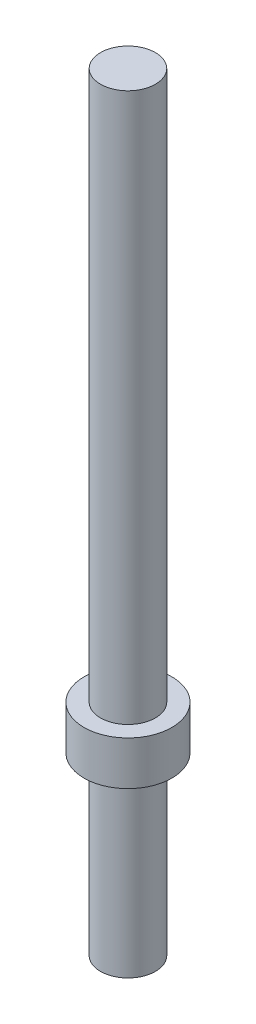
ISO-10303-21;
HEADER;
FILE_DESCRIPTION(('STEP AP214'),'2;1');
FILE_NAME('part.step','',(''),(''),'','','');
FILE_SCHEMA(('AUTOMOTIVE_DESIGN { 1 0 10303 214 1 1 1 1 }'));
ENDSEC;
DATA;
#1=APPLICATION_CONTEXT('core data for automotive mechanical design processes');
#2=APPLICATION_PROTOCOL_DEFINITION('international standard','automotive_design',2000,#1);
#3=PRODUCT_CONTEXT('',#1,'mechanical');
#4=PRODUCT('Part','Part','',(#3));
#5=PRODUCT_RELATED_PRODUCT_CATEGORY('part','',(#4));
#6=PRODUCT_DEFINITION_FORMATION('','',#4);
#7=PRODUCT_DEFINITION_CONTEXT('part definition',#1,'design');
#8=PRODUCT_DEFINITION('design','',#6,#7);
#9=PRODUCT_DEFINITION_SHAPE('','',#8);
#10=(LENGTH_UNIT() NAMED_UNIT(*) SI_UNIT(.MILLI.,.METRE.));
#11=(NAMED_UNIT(*) PLANE_ANGLE_UNIT() SI_UNIT($,.RADIAN.));
#12=(NAMED_UNIT(*) SI_UNIT($,.STERADIAN.) SOLID_ANGLE_UNIT());
#13=UNCERTAINTY_MEASURE_WITH_UNIT(LENGTH_MEASURE(1.E-05),#10,'distance_accuracy_value','');
#14=(GEOMETRIC_REPRESENTATION_CONTEXT(3) GLOBAL_UNCERTAINTY_ASSIGNED_CONTEXT((#13)) GLOBAL_UNIT_ASSIGNED_CONTEXT((#10,
#11,#12)) REPRESENTATION_CONTEXT('',''));
#15=CARTESIAN_POINT('',(0.,0.,0.));
#16=DIRECTION('',(0.,0.,1.));
#17=DIRECTION('',(1.,0.,0.));
#18=AXIS2_PLACEMENT_3D('',#15,#16,#17);
#19=CARTESIAN_POINT('',(0.,50.,0.));
#20=DIRECTION('',(0.,-1.,0.));
#21=DIRECTION('',(0.,0.,-1.));
#22=AXIS2_PLACEMENT_3D('',#19,#20,#21);
#23=CYLINDRICAL_SURFACE('',#22,2.5);
#24=CARTESIAN_POINT('',(0.,50.,0.));
#25=DIRECTION('',(0.,1.,0.));
#26=DIRECTION('',(0.,0.,1.));
#27=AXIS2_PLACEMENT_3D('',#24,#25,#26);
#28=CIRCLE('',#27,2.5);
#29=CARTESIAN_POINT('',(0.,50.,2.5));
#30=VERTEX_POINT('',#29);
#31=EDGE_CURVE('E10',#30,#30,#28,.T.);
#32=ORIENTED_EDGE('',*,*,#31,.F.);
#33=EDGE_LOOP('',(#32));
#34=FACE_BOUND('',#33,.T.);
#35=CARTESIAN_POINT('',(0.,0.,0.));
#36=DIRECTION('',(0.,1.,0.));
#37=DIRECTION('',(0.,0.,1.));
#38=AXIS2_PLACEMENT_3D('',#35,#36,#37);
#39=CIRCLE('',#38,2.5);
#40=CARTESIAN_POINT('',(0.,0.,2.5));
#41=VERTEX_POINT('',#40);
#42=EDGE_CURVE('E36',#41,#41,#39,.T.);
#43=ORIENTED_EDGE('',*,*,#42,.T.);
#44=EDGE_LOOP('',(#43));
#45=FACE_BOUND('',#44,.T.);
#46=ADVANCED_FACE('F30',(#34,#45),#23,.T.);
#47=CARTESIAN_POINT('',(0.,50.,0.));
#48=DIRECTION('',(0.,1.,0.));
#49=DIRECTION('',(0.,0.,1.));
#50=AXIS2_PLACEMENT_3D('',#47,#48,#49);
#51=PLANE('',#50);
#52=ORIENTED_EDGE('',*,*,#31,.T.);
#53=EDGE_LOOP('',(#52));
#54=FACE_BOUND('',#53,.T.);
#55=ADVANCED_FACE('F68',(#54),#51,.T.);
#56=CARTESIAN_POINT('',(0.,-4.,0.));
#57=DIRECTION('',(0.,1.,0.));
#58=DIRECTION('',(0.,0.,1.));
#59=AXIS2_PLACEMENT_3D('',#56,#57,#58);
#60=CYLINDRICAL_SURFACE('',#59,4.);
#61=CARTESIAN_POINT('',(0.,-4.,0.));
#62=DIRECTION('',(0.,1.,0.));
#63=DIRECTION('',(0.,0.,1.));
#64=AXIS2_PLACEMENT_3D('',#61,#62,#63);
#65=CIRCLE('',#64,4.);
#66=CARTESIAN_POINT('',(0.,-4.,4.));
#67=VERTEX_POINT('',#66);
#68=EDGE_CURVE('E40',#67,#67,#65,.T.);
#69=ORIENTED_EDGE('',*,*,#68,.T.);
#70=EDGE_LOOP('',(#69));
#71=FACE_BOUND('',#70,.T.);
#72=CARTESIAN_POINT('',(0.,0.,0.));
#73=DIRECTION('',(0.,1.,0.));
#74=DIRECTION('',(0.,0.,1.));
#75=AXIS2_PLACEMENT_3D('',#72,#73,#74);
#76=CIRCLE('',#75,4.);
#77=CARTESIAN_POINT('',(0.,0.,4.));
#78=VERTEX_POINT('',#77);
#79=EDGE_CURVE('E44',#78,#78,#76,.T.);
#80=ORIENTED_EDGE('',*,*,#79,.F.);
#81=EDGE_LOOP('',(#80));
#82=FACE_BOUND('',#81,.T.);
#83=ADVANCED_FACE('F73',(#71,#82),#60,.T.);
#84=CARTESIAN_POINT('',(0.,-4.,0.));
#85=DIRECTION('',(0.,1.,0.));
#86=DIRECTION('',(0.,0.,1.));
#87=AXIS2_PLACEMENT_3D('',#84,#85,#86);
#88=PLANE('',#87);
#89=CARTESIAN_POINT('',(0.,-4.,0.));
#90=DIRECTION('',(0.,1.,0.));
#91=DIRECTION('',(0.,0.,1.));
#92=AXIS2_PLACEMENT_3D('',#89,#90,#91);
#93=CIRCLE('',#92,2.5);
#94=CARTESIAN_POINT('',(0.,-4.,2.5));
#95=VERTEX_POINT('',#94);
#96=EDGE_CURVE('E48',#95,#95,#93,.T.);
#97=ORIENTED_EDGE('',*,*,#96,.T.);
#98=EDGE_LOOP('',(#97));
#99=FACE_BOUND('',#98,.T.);
#100=ORIENTED_EDGE('',*,*,#68,.F.);
#101=EDGE_LOOP('',(#100));
#102=FACE_BOUND('',#101,.T.);
#103=ADVANCED_FACE('F77',(#99,#102),#88,.F.);
#104=CARTESIAN_POINT('',(0.,0.,0.));
#105=DIRECTION('',(0.,1.,0.));
#106=DIRECTION('',(0.,0.,1.));
#107=AXIS2_PLACEMENT_3D('',#104,#105,#106);
#108=PLANE('',#107);
#109=ORIENTED_EDGE('',*,*,#42,.F.);
#110=EDGE_LOOP('',(#109));
#111=FACE_BOUND('',#110,.T.);
#112=ORIENTED_EDGE('',*,*,#79,.T.);
#113=EDGE_LOOP('',(#112));
#114=FACE_BOUND('',#113,.T.);
#115=ADVANCED_FACE('F65',(#111,#114),#108,.T.);
#116=CARTESIAN_POINT('',(0.,-20.,0.));
#117=DIRECTION('',(0.,1.,0.));
#118=DIRECTION('',(0.,0.,1.));
#119=AXIS2_PLACEMENT_3D('',#116,#117,#118);
#120=CYLINDRICAL_SURFACE('',#119,2.5);
#121=CARTESIAN_POINT('',(0.,-20.,0.));
#122=DIRECTION('',(0.,1.,0.));
#123=DIRECTION('',(0.,0.,1.));
#124=AXIS2_PLACEMENT_3D('',#121,#122,#123);
#125=CIRCLE('',#124,2.5);
#126=CARTESIAN_POINT('',(0.,-20.,2.5));
#127=VERTEX_POINT('',#126);
#128=EDGE_CURVE('E52',#127,#127,#125,.T.);
#129=ORIENTED_EDGE('',*,*,#128,.T.);
#130=EDGE_LOOP('',(#129));
#131=FACE_BOUND('',#130,.T.);
#132=ORIENTED_EDGE('',*,*,#96,.F.);
#133=EDGE_LOOP('',(#132));
#134=FACE_BOUND('',#133,.T.);
#135=ADVANCED_FACE('F56',(#131,#134),#120,.T.);
#136=CARTESIAN_POINT('',(0.,-20.,0.));
#137=DIRECTION('',(0.,1.,0.));
#138=DIRECTION('',(0.,0.,1.));
#139=AXIS2_PLACEMENT_3D('',#136,#137,#138);
#140=PLANE('',#139);
#141=ORIENTED_EDGE('',*,*,#128,.F.);
#142=EDGE_LOOP('',(#141));
#143=FACE_BOUND('',#142,.T.);
#144=ADVANCED_FACE('F59',(#143),#140,.F.);
#145=CLOSED_SHELL('',(#46,#55,#83,#103,#115,#135,#144));
#146=MANIFOLD_SOLID_BREP('B2',#145);
#147=ADVANCED_BREP_SHAPE_REPRESENTATION('',(#18,#146),#14);
#148=SHAPE_DEFINITION_REPRESENTATION(#9,#147);
ENDSEC;
END-ISO-10303-21;
